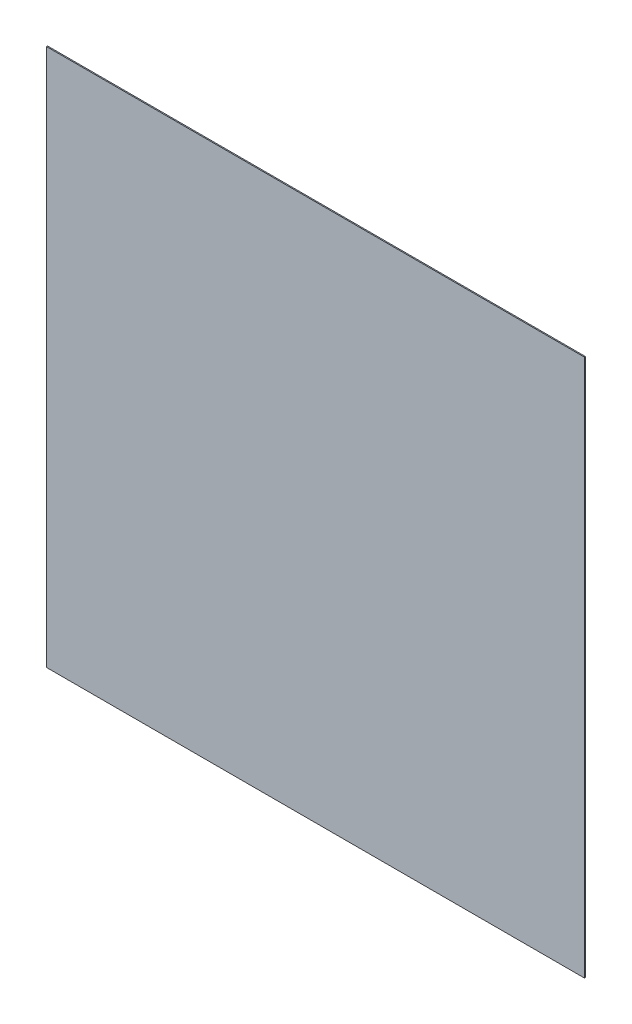
ISO-10303-21;
HEADER;
FILE_DESCRIPTION(('STEP AP214'),'2;1');
FILE_NAME('part.step','',(''),(''),'','','');
FILE_SCHEMA(('AUTOMOTIVE_DESIGN { 1 0 10303 214 1 1 1 1 }'));
ENDSEC;
DATA;
#1=APPLICATION_CONTEXT('core data for automotive mechanical design processes');
#2=APPLICATION_PROTOCOL_DEFINITION('international standard','automotive_design',2000,#1);
#3=PRODUCT_CONTEXT('',#1,'mechanical');
#4=PRODUCT('Part','Part','',(#3));
#5=PRODUCT_RELATED_PRODUCT_CATEGORY('part','',(#4));
#6=PRODUCT_DEFINITION_FORMATION('','',#4);
#7=PRODUCT_DEFINITION_CONTEXT('part definition',#1,'design');
#8=PRODUCT_DEFINITION('design','',#6,#7);
#9=PRODUCT_DEFINITION_SHAPE('','',#8);
#10=(LENGTH_UNIT() NAMED_UNIT(*) SI_UNIT(.MILLI.,.METRE.));
#11=(NAMED_UNIT(*) PLANE_ANGLE_UNIT() SI_UNIT($,.RADIAN.));
#12=(NAMED_UNIT(*) SI_UNIT($,.STERADIAN.) SOLID_ANGLE_UNIT());
#13=UNCERTAINTY_MEASURE_WITH_UNIT(LENGTH_MEASURE(1.E-05),#10,'distance_accuracy_value','');
#14=(GEOMETRIC_REPRESENTATION_CONTEXT(3) GLOBAL_UNCERTAINTY_ASSIGNED_CONTEXT((#13)) GLOBAL_UNIT_ASSIGNED_CONTEXT((#10,
#11,#12)) REPRESENTATION_CONTEXT('',''));
#15=CARTESIAN_POINT('',(0.,0.,0.));
#16=DIRECTION('',(0.,0.,1.));
#17=DIRECTION('',(1.,0.,0.));
#18=AXIS2_PLACEMENT_3D('',#15,#16,#17);
#19=CARTESIAN_POINT('',(-1250.,-1250.,5.));
#20=DIRECTION('',(1.,0.,0.));
#21=DIRECTION('',(0.,0.,-1.));
#22=AXIS2_PLACEMENT_3D('',#19,#20,#21);
#23=PLANE('',#22);
#24=DIRECTION('',(0.,-1.,0.));
#25=VECTOR('',#24,1.);
#26=CARTESIAN_POINT('',(-1250.,-1250.,0.));
#27=LINE('',#26,#25);
#28=CARTESIAN_POINT('',(-1250.,1250.,0.));
#29=VERTEX_POINT('',#28);
#30=CARTESIAN_POINT('',(-1250.,-1250.,0.));
#31=VERTEX_POINT('',#30);
#32=EDGE_CURVE('E96',#29,#31,#27,.T.);
#33=ORIENTED_EDGE('',*,*,#32,.T.);
#34=DIRECTION('',(0.,0.,-1.));
#35=VECTOR('',#34,1.);
#36=CARTESIAN_POINT('',(-1250.,-1250.,5.));
#37=LINE('',#36,#35);
#38=CARTESIAN_POINT('',(-1250.,-1250.,5.));
#39=VERTEX_POINT('',#38);
#40=EDGE_CURVE('E11',#39,#31,#37,.T.);
#41=ORIENTED_EDGE('',*,*,#40,.F.);
#42=DIRECTION('',(0.,-1.,0.));
#43=VECTOR('',#42,1.);
#44=CARTESIAN_POINT('',(-1250.,-1250.,5.));
#45=LINE('',#44,#43);
#46=CARTESIAN_POINT('',(-1250.,1250.,5.));
#47=VERTEX_POINT('',#46);
#48=EDGE_CURVE('E84',#47,#39,#45,.T.);
#49=ORIENTED_EDGE('',*,*,#48,.F.);
#50=DIRECTION('',(0.,0.,-1.));
#51=VECTOR('',#50,1.);
#52=CARTESIAN_POINT('',(-1250.,1250.,5.));
#53=LINE('',#52,#51);
#54=EDGE_CURVE('E92',#47,#29,#53,.T.);
#55=ORIENTED_EDGE('',*,*,#54,.T.);
#56=EDGE_LOOP('',(#33,#41,#49,#55));
#57=FACE_BOUND('',#56,.T.);
#58=ADVANCED_FACE('F33',(#57),#23,.F.);
#59=CARTESIAN_POINT('',(1250.,-1250.,5.));
#60=DIRECTION('',(0.,1.,0.));
#61=DIRECTION('',(-1.,0.,0.));
#62=AXIS2_PLACEMENT_3D('',#59,#60,#61);
#63=PLANE('',#62);
#64=DIRECTION('',(1.,0.,0.));
#65=VECTOR('',#64,1.);
#66=CARTESIAN_POINT('',(1250.,-1250.,0.));
#67=LINE('',#66,#65);
#68=CARTESIAN_POINT('',(1250.,-1250.,0.));
#69=VERTEX_POINT('',#68);
#70=EDGE_CURVE('E88',#31,#69,#67,.T.);
#71=ORIENTED_EDGE('',*,*,#70,.T.);
#72=DIRECTION('',(0.,0.,-1.));
#73=VECTOR('',#72,1.);
#74=CARTESIAN_POINT('',(1250.,-1250.,5.));
#75=LINE('',#74,#73);
#76=CARTESIAN_POINT('',(1250.,-1250.,5.));
#77=VERTEX_POINT('',#76);
#78=EDGE_CURVE('E41',#77,#69,#75,.T.);
#79=ORIENTED_EDGE('',*,*,#78,.F.);
#80=DIRECTION('',(1.,0.,0.));
#81=VECTOR('',#80,1.);
#82=CARTESIAN_POINT('',(1250.,-1250.,5.));
#83=LINE('',#82,#81);
#84=EDGE_CURVE('E79',#39,#77,#83,.T.);
#85=ORIENTED_EDGE('',*,*,#84,.F.);
#86=ORIENTED_EDGE('',*,*,#40,.T.);
#87=EDGE_LOOP('',(#71,#79,#85,#86));
#88=FACE_BOUND('',#87,.T.);
#89=ADVANCED_FACE('F87',(#88),#63,.F.);
#90=CARTESIAN_POINT('',(1250.,-1250.,5.));
#91=DIRECTION('',(-1.,0.,0.));
#92=DIRECTION('',(0.,0.,1.));
#93=AXIS2_PLACEMENT_3D('',#90,#91,#92);
#94=PLANE('',#93);
#95=DIRECTION('',(0.,1.,0.));
#96=VECTOR('',#95,1.);
#97=CARTESIAN_POINT('',(1250.,-1250.,0.));
#98=LINE('',#97,#96);
#99=CARTESIAN_POINT('',(1250.,1250.,0.));
#100=VERTEX_POINT('',#99);
#101=EDGE_CURVE('E66',#69,#100,#98,.T.);
#102=ORIENTED_EDGE('',*,*,#101,.T.);
#103=DIRECTION('',(0.,0.,-1.));
#104=VECTOR('',#103,1.);
#105=CARTESIAN_POINT('',(1250.,1250.,5.));
#106=LINE('',#105,#104);
#107=CARTESIAN_POINT('',(1250.,1250.,5.));
#108=VERTEX_POINT('',#107);
#109=EDGE_CURVE('E89',#108,#100,#106,.T.);
#110=ORIENTED_EDGE('',*,*,#109,.F.);
#111=DIRECTION('',(0.,1.,0.));
#112=VECTOR('',#111,1.);
#113=CARTESIAN_POINT('',(1250.,-1250.,5.));
#114=LINE('',#113,#112);
#115=EDGE_CURVE('E82',#77,#108,#114,.T.);
#116=ORIENTED_EDGE('',*,*,#115,.F.);
#117=ORIENTED_EDGE('',*,*,#78,.T.);
#118=EDGE_LOOP('',(#102,#110,#116,#117));
#119=FACE_BOUND('',#118,.T.);
#120=ADVANCED_FACE('F90',(#119),#94,.F.);
#121=CARTESIAN_POINT('',(1250.,1250.,5.));
#122=DIRECTION('',(0.,-1.,0.));
#123=DIRECTION('',(0.,0.,-1.));
#124=AXIS2_PLACEMENT_3D('',#121,#122,#123);
#125=PLANE('',#124);
#126=DIRECTION('',(-1.,0.,0.));
#127=VECTOR('',#126,1.);
#128=CARTESIAN_POINT('',(1250.,1250.,0.));
#129=LINE('',#128,#127);
#130=EDGE_CURVE('E72',#100,#29,#129,.T.);
#131=ORIENTED_EDGE('',*,*,#130,.T.);
#132=ORIENTED_EDGE('',*,*,#54,.F.);
#133=DIRECTION('',(-1.,0.,0.));
#134=VECTOR('',#133,1.);
#135=CARTESIAN_POINT('',(1250.,1250.,5.));
#136=LINE('',#135,#134);
#137=EDGE_CURVE('E49',#108,#47,#136,.T.);
#138=ORIENTED_EDGE('',*,*,#137,.F.);
#139=ORIENTED_EDGE('',*,*,#109,.T.);
#140=EDGE_LOOP('',(#131,#132,#138,#139));
#141=FACE_BOUND('',#140,.T.);
#142=ADVANCED_FACE('F103',(#141),#125,.F.);
#143=CARTESIAN_POINT('',(0.,0.,5.));
#144=DIRECTION('',(0.,0.,1.));
#145=DIRECTION('',(1.,0.,0.));
#146=AXIS2_PLACEMENT_3D('',#143,#144,#145);
#147=PLANE('',#146);
#148=ORIENTED_EDGE('',*,*,#48,.T.);
#149=ORIENTED_EDGE('',*,*,#84,.T.);
#150=ORIENTED_EDGE('',*,*,#115,.T.);
#151=ORIENTED_EDGE('',*,*,#137,.T.);
#152=EDGE_LOOP('',(#148,#149,#150,#151));
#153=FACE_BOUND('',#152,.T.);
#154=ADVANCED_FACE('F80',(#153),#147,.T.);
#155=CARTESIAN_POINT('',(0.,0.,0.));
#156=DIRECTION('',(0.,0.,1.));
#157=DIRECTION('',(1.,0.,0.));
#158=AXIS2_PLACEMENT_3D('',#155,#156,#157);
#159=PLANE('',#158);
#160=ORIENTED_EDGE('',*,*,#32,.F.);
#161=ORIENTED_EDGE('',*,*,#130,.F.);
#162=ORIENTED_EDGE('',*,*,#101,.F.);
#163=ORIENTED_EDGE('',*,*,#70,.F.);
#164=EDGE_LOOP('',(#160,#161,#162,#163));
#165=FACE_BOUND('',#164,.T.);
#166=ADVANCED_FACE('F106',(#165),#159,.F.);
#167=CLOSED_SHELL('',(#58,#89,#120,#142,#154,#166));
#168=MANIFOLD_SOLID_BREP('B2',#167);
#169=ADVANCED_BREP_SHAPE_REPRESENTATION('',(#18,#168),#14);
#170=SHAPE_DEFINITION_REPRESENTATION(#9,#169);
ENDSEC;
END-ISO-10303-21;
